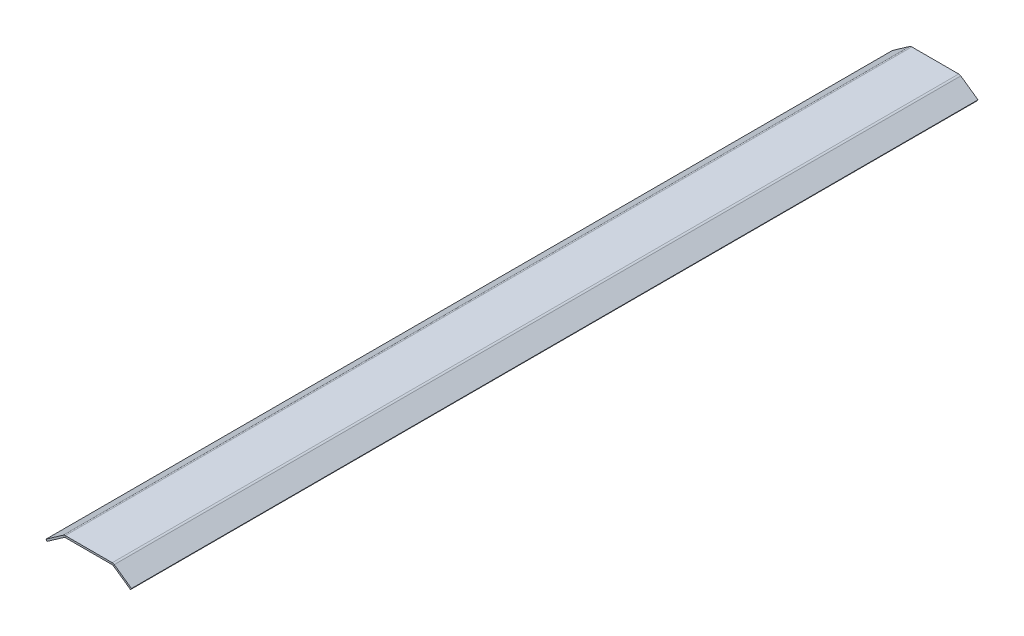
ISO-10303-21;
HEADER;
FILE_DESCRIPTION(('STEP AP214'),'2;1');
FILE_NAME('part.step','',(''),(''),'','','');
FILE_SCHEMA(('AUTOMOTIVE_DESIGN { 1 0 10303 214 1 1 1 1 }'));
ENDSEC;
DATA;
#1=APPLICATION_CONTEXT('core data for automotive mechanical design processes');
#2=APPLICATION_PROTOCOL_DEFINITION('international standard','automotive_design',2000,#1);
#3=PRODUCT_CONTEXT('',#1,'mechanical');
#4=PRODUCT('Part','Part','',(#3));
#5=PRODUCT_RELATED_PRODUCT_CATEGORY('part','',(#4));
#6=PRODUCT_DEFINITION_FORMATION('','',#4);
#7=PRODUCT_DEFINITION_CONTEXT('part definition',#1,'design');
#8=PRODUCT_DEFINITION('design','',#6,#7);
#9=PRODUCT_DEFINITION_SHAPE('','',#8);
#10=(LENGTH_UNIT() NAMED_UNIT(*) SI_UNIT(.MILLI.,.METRE.));
#11=(NAMED_UNIT(*) PLANE_ANGLE_UNIT() SI_UNIT($,.RADIAN.));
#12=(NAMED_UNIT(*) SI_UNIT($,.STERADIAN.) SOLID_ANGLE_UNIT());
#13=UNCERTAINTY_MEASURE_WITH_UNIT(LENGTH_MEASURE(1.E-05),#10,'distance_accuracy_value','');
#14=(GEOMETRIC_REPRESENTATION_CONTEXT(3) GLOBAL_UNCERTAINTY_ASSIGNED_CONTEXT((#13)) GLOBAL_UNIT_ASSIGNED_CONTEXT((#10,
#11,#12)) REPRESENTATION_CONTEXT('',''));
#15=CARTESIAN_POINT('',(0.,0.,0.));
#16=DIRECTION('',(0.,0.,1.));
#17=DIRECTION('',(1.,0.,0.));
#18=AXIS2_PLACEMENT_3D('',#15,#16,#17);
#19=CARTESIAN_POINT('',(13.8332776474721,-0.180847955711021,-478.));
#20=DIRECTION('',(0.,0.,-1.));
#21=DIRECTION('',(-1.,0.,0.));
#22=AXIS2_PLACEMENT_3D('',#19,#20,#21);
#23=PLANE('',#22);
#24=DIRECTION('',(0.573576436351041,0.819152044288995,0.));
#25=VECTOR('',#24,1.);
#26=CARTESIAN_POINT('',(13.8332776474721,-0.180847955711021,-478.));
#27=LINE('',#26,#25);
#28=CARTESIAN_POINT('',(13.8332776474721,-0.180847955711021,-478.));
#29=VERTEX_POINT('',#28);
#30=CARTESIAN_POINT('',(14.4068540838231,0.638304088577982,-478.));
#31=VERTEX_POINT('',#30);
#32=EDGE_CURVE('E11',#29,#31,#27,.T.);
#33=ORIENTED_EDGE('',*,*,#32,.F.);
#34=CARTESIAN_POINT('',(13.259701211121,-1.00000000000001,-478.));
#35=DIRECTION('',(0.,0.,-1.));
#36=DIRECTION('',(-1.,0.,0.));
#37=AXIS2_PLACEMENT_3D('',#34,#35,#36);
#38=CIRCLE('',#37,1.);
#39=CARTESIAN_POINT('',(13.259701211121,0.,-478.));
#40=VERTEX_POINT('',#39);
#41=EDGE_CURVE('E140',#29,#40,#38,.F.);
#42=ORIENTED_EDGE('',*,*,#41,.T.);
#43=DIRECTION('',(0.,-1.,0.));
#44=VECTOR('',#43,1.);
#45=CARTESIAN_POINT('',(13.259701211121,1.,-478.));
#46=LINE('',#45,#44);
#47=CARTESIAN_POINT('',(13.259701211121,1.,-478.));
#48=VERTEX_POINT('',#47);
#49=EDGE_CURVE('E44',#48,#40,#46,.T.);
#50=ORIENTED_EDGE('',*,*,#49,.F.);
#51=CARTESIAN_POINT('',(13.259701211121,-1.00000000000001,-478.));
#52=DIRECTION('',(0.,0.,1.));
#53=DIRECTION('',(1.,0.,0.));
#54=AXIS2_PLACEMENT_3D('',#51,#52,#53);
#55=CIRCLE('',#54,2.);
#56=EDGE_CURVE('E137',#31,#48,#55,.T.);
#57=ORIENTED_EDGE('',*,*,#56,.F.);
#58=EDGE_LOOP('',(#33,#42,#50,#57));
#59=FACE_BOUND('',#58,.T.);
#60=ADVANCED_FACE('F36',(#59),#23,.T.);
#61=CARTESIAN_POINT('',(13.259701211121,1.,-478.));
#62=DIRECTION('',(0.,0.,-1.));
#63=DIRECTION('',(-1.,0.,0.));
#64=AXIS2_PLACEMENT_3D('',#61,#62,#63);
#65=PLANE('',#64);
#66=DIRECTION('',(-0.819152044288995,0.573576436351042,0.));
#67=VECTOR('',#66,1.);
#68=CARTESIAN_POINT('',(13.575,0.,-478.));
#69=LINE('',#68,#67);
#70=CARTESIAN_POINT('',(23.5720360471949,-7.,-478.));
#71=VERTEX_POINT('',#70);
#72=EDGE_CURVE('E257',#71,#29,#69,.T.);
#73=ORIENTED_EDGE('',*,*,#72,.T.);
#74=ORIENTED_EDGE('',*,*,#32,.T.);
#75=DIRECTION('',(-0.819152044288995,0.573576436351042,0.));
#76=VECTOR('',#75,1.);
#77=CARTESIAN_POINT('',(14.148576436351,0.819152044288995,-478.));
#78=LINE('',#77,#76);
#79=CARTESIAN_POINT('',(24.145612483546,-6.18084795571101,-478.));
#80=VERTEX_POINT('',#79);
#81=EDGE_CURVE('E169',#80,#31,#78,.T.);
#82=ORIENTED_EDGE('',*,*,#81,.F.);
#83=DIRECTION('',(-0.573576436351044,-0.819152044288993,0.));
#84=VECTOR('',#83,1.);
#85=CARTESIAN_POINT('',(24.145612483546,-6.18084795571101,-478.));
#86=LINE('',#85,#84);
#87=EDGE_CURVE('E171',#80,#71,#86,.T.);
#88=ORIENTED_EDGE('',*,*,#87,.T.);
#89=EDGE_LOOP('',(#73,#74,#82,#88));
#90=FACE_BOUND('',#89,.T.);
#91=ADVANCED_FACE('F268',(#90),#65,.T.);
#92=CARTESIAN_POINT('',(13.259701211121,0.,0.));
#93=DIRECTION('',(0.,0.,1.));
#94=DIRECTION('',(1.,0.,0.));
#95=AXIS2_PLACEMENT_3D('',#92,#93,#94);
#96=PLANE('',#95);
#97=DIRECTION('',(0.,1.,0.));
#98=VECTOR('',#97,1.);
#99=CARTESIAN_POINT('',(13.259701211121,0.,0.));
#100=LINE('',#99,#98);
#101=CARTESIAN_POINT('',(13.259701211121,0.,0.));
#102=VERTEX_POINT('',#101);
#103=CARTESIAN_POINT('',(13.259701211121,1.,0.));
#104=VERTEX_POINT('',#103);
#105=EDGE_CURVE('E145',#102,#104,#100,.T.);
#106=ORIENTED_EDGE('',*,*,#105,.F.);
#107=CARTESIAN_POINT('',(13.259701211121,-1.00000000000001,0.));
#108=DIRECTION('',(0.,0.,-1.));
#109=DIRECTION('',(-1.,0.,0.));
#110=AXIS2_PLACEMENT_3D('',#107,#108,#109);
#111=CIRCLE('',#110,1.);
#112=CARTESIAN_POINT('',(13.8332776474721,-0.180847955711021,0.));
#113=VERTEX_POINT('',#112);
#114=EDGE_CURVE('E191',#113,#102,#111,.F.);
#115=ORIENTED_EDGE('',*,*,#114,.F.);
#116=DIRECTION('',(-0.573576436351041,-0.819152044288995,0.));
#117=VECTOR('',#116,1.);
#118=CARTESIAN_POINT('',(14.4068540838231,0.638304088577982,0.));
#119=LINE('',#118,#117);
#120=CARTESIAN_POINT('',(14.4068540838231,0.638304088577982,0.));
#121=VERTEX_POINT('',#120);
#122=EDGE_CURVE('E237',#121,#113,#119,.T.);
#123=ORIENTED_EDGE('',*,*,#122,.F.);
#124=CARTESIAN_POINT('',(13.259701211121,-1.00000000000001,0.));
#125=DIRECTION('',(0.,0.,1.));
#126=DIRECTION('',(1.,0.,0.));
#127=AXIS2_PLACEMENT_3D('',#124,#125,#126);
#128=CIRCLE('',#127,2.);
#129=EDGE_CURVE('E202',#121,#104,#128,.T.);
#130=ORIENTED_EDGE('',*,*,#129,.T.);
#131=EDGE_LOOP('',(#106,#115,#123,#130));
#132=FACE_BOUND('',#131,.T.);
#133=ADVANCED_FACE('F245',(#132),#96,.T.);
#134=CARTESIAN_POINT('',(14.4068540838231,0.638304088577982,0.));
#135=DIRECTION('',(0.,0.,1.));
#136=DIRECTION('',(1.,0.,0.));
#137=AXIS2_PLACEMENT_3D('',#134,#135,#136);
#138=PLANE('',#137);
#139=DIRECTION('',(-1.,0.,0.));
#140=VECTOR('',#139,1.);
#141=CARTESIAN_POINT('',(-13.575,0.,0.));
#142=LINE('',#141,#140);
#143=CARTESIAN_POINT('',(-13.259701211121,0.,0.));
#144=VERTEX_POINT('',#143);
#145=EDGE_CURVE('E188',#102,#144,#142,.T.);
#146=ORIENTED_EDGE('',*,*,#145,.F.);
#147=ORIENTED_EDGE('',*,*,#105,.T.);
#148=DIRECTION('',(1.,0.,0.));
#149=VECTOR('',#148,1.);
#150=CARTESIAN_POINT('',(-13.575,1.,0.));
#151=LINE('',#150,#149);
#152=CARTESIAN_POINT('',(-13.259701211121,1.,0.));
#153=VERTEX_POINT('',#152);
#154=EDGE_CURVE('E154',#104,#153,#151,.F.);
#155=ORIENTED_EDGE('',*,*,#154,.T.);
#156=DIRECTION('',(0.,-1.,0.));
#157=VECTOR('',#156,1.);
#158=CARTESIAN_POINT('',(-13.259701211121,1.,0.));
#159=LINE('',#158,#157);
#160=EDGE_CURVE('E93',#153,#144,#159,.T.);
#161=ORIENTED_EDGE('',*,*,#160,.T.);
#162=EDGE_LOOP('',(#146,#147,#155,#161));
#163=FACE_BOUND('',#162,.T.);
#164=ADVANCED_FACE('F241',(#163),#138,.T.);
#165=CARTESIAN_POINT('',(-13.259701211121,0.,-478.));
#166=DIRECTION('',(0.,0.,-1.));
#167=DIRECTION('',(-1.,0.,0.));
#168=AXIS2_PLACEMENT_3D('',#165,#166,#167);
#169=PLANE('',#168);
#170=DIRECTION('',(0.,1.,0.));
#171=VECTOR('',#170,1.);
#172=CARTESIAN_POINT('',(-13.259701211121,0.,-478.));
#173=LINE('',#172,#171);
#174=CARTESIAN_POINT('',(-13.259701211121,0.,-478.));
#175=VERTEX_POINT('',#174);
#176=CARTESIAN_POINT('',(-13.259701211121,1.,-478.));
#177=VERTEX_POINT('',#176);
#178=EDGE_CURVE('E162',#175,#177,#173,.T.);
#179=ORIENTED_EDGE('',*,*,#178,.F.);
#180=CARTESIAN_POINT('',(-13.259701211121,-1.,-478.));
#181=DIRECTION('',(0.,0.,-1.));
#182=DIRECTION('',(-1.,0.,0.));
#183=AXIS2_PLACEMENT_3D('',#180,#181,#182);
#184=CIRCLE('',#183,1.);
#185=CARTESIAN_POINT('',(-13.8332776474721,-0.180847955711005,-478.));
#186=VERTEX_POINT('',#185);
#187=EDGE_CURVE('E255',#175,#186,#184,.F.);
#188=ORIENTED_EDGE('',*,*,#187,.T.);
#189=DIRECTION('',(0.573576436351041,-0.819152044288995,0.));
#190=VECTOR('',#189,1.);
#191=CARTESIAN_POINT('',(-14.4068540838231,0.638304088577989,-478.));
#192=LINE('',#191,#190);
#193=CARTESIAN_POINT('',(-14.4068540838231,0.638304088577989,-478.));
#194=VERTEX_POINT('',#193);
#195=EDGE_CURVE('E52',#194,#186,#192,.T.);
#196=ORIENTED_EDGE('',*,*,#195,.F.);
#197=CARTESIAN_POINT('',(-13.259701211121,-1.,-478.));
#198=DIRECTION('',(0.,0.,1.));
#199=DIRECTION('',(1.,0.,0.));
#200=AXIS2_PLACEMENT_3D('',#197,#198,#199);
#201=CIRCLE('',#200,2.);
#202=EDGE_CURVE('E164',#177,#194,#201,.T.);
#203=ORIENTED_EDGE('',*,*,#202,.F.);
#204=EDGE_LOOP('',(#179,#188,#196,#203));
#205=FACE_BOUND('',#204,.T.);
#206=ADVANCED_FACE('F300',(#205),#169,.T.);
#207=CARTESIAN_POINT('',(-14.4068540838231,0.638304088577989,-478.));
#208=DIRECTION('',(0.,0.,-1.));
#209=DIRECTION('',(-1.,0.,0.));
#210=AXIS2_PLACEMENT_3D('',#207,#208,#209);
#211=PLANE('',#210);
#212=DIRECTION('',(-1.,0.,0.));
#213=VECTOR('',#212,1.);
#214=CARTESIAN_POINT('',(-13.575,0.,-478.));
#215=LINE('',#214,#213);
#216=EDGE_CURVE('E253',#40,#175,#215,.T.);
#217=ORIENTED_EDGE('',*,*,#216,.T.);
#218=ORIENTED_EDGE('',*,*,#178,.T.);
#219=DIRECTION('',(1.,0.,0.));
#220=VECTOR('',#219,1.);
#221=CARTESIAN_POINT('',(-13.575,1.,-478.));
#222=LINE('',#221,#220);
#223=EDGE_CURVE('E152',#48,#177,#222,.F.);
#224=ORIENTED_EDGE('',*,*,#223,.F.);
#225=ORIENTED_EDGE('',*,*,#49,.T.);
#226=EDGE_LOOP('',(#217,#218,#224,#225));
#227=FACE_BOUND('',#226,.T.);
#228=ADVANCED_FACE('F161',(#227),#211,.T.);
#229=CARTESIAN_POINT('',(-13.8332776474721,-0.180847955711005,0.));
#230=DIRECTION('',(0.,0.,1.));
#231=DIRECTION('',(1.,0.,0.));
#232=AXIS2_PLACEMENT_3D('',#229,#230,#231);
#233=PLANE('',#232);
#234=DIRECTION('',(-0.573576436351041,0.819152044288995,0.));
#235=VECTOR('',#234,1.);
#236=CARTESIAN_POINT('',(-13.8332776474721,-0.180847955711005,0.));
#237=LINE('',#236,#235);
#238=CARTESIAN_POINT('',(-13.8332776474721,-0.180847955711005,0.));
#239=VERTEX_POINT('',#238);
#240=CARTESIAN_POINT('',(-14.4068540838231,0.638304088577989,0.));
#241=VERTEX_POINT('',#240);
#242=EDGE_CURVE('E100',#239,#241,#237,.T.);
#243=ORIENTED_EDGE('',*,*,#242,.F.);
#244=CARTESIAN_POINT('',(-13.259701211121,-1.,0.));
#245=DIRECTION('',(0.,0.,-1.));
#246=DIRECTION('',(-1.,0.,0.));
#247=AXIS2_PLACEMENT_3D('',#244,#245,#246);
#248=CIRCLE('',#247,1.);
#249=EDGE_CURVE('E185',#144,#239,#248,.F.);
#250=ORIENTED_EDGE('',*,*,#249,.F.);
#251=ORIENTED_EDGE('',*,*,#160,.F.);
#252=CARTESIAN_POINT('',(-13.259701211121,-1.,0.));
#253=DIRECTION('',(0.,0.,1.));
#254=DIRECTION('',(1.,0.,0.));
#255=AXIS2_PLACEMENT_3D('',#252,#253,#254);
#256=CIRCLE('',#255,2.);
#257=EDGE_CURVE('E205',#153,#241,#256,.T.);
#258=ORIENTED_EDGE('',*,*,#257,.T.);
#259=EDGE_LOOP('',(#243,#250,#251,#258));
#260=FACE_BOUND('',#259,.T.);
#261=ADVANCED_FACE('F305',(#260),#233,.T.);
#262=CARTESIAN_POINT('',(-13.259701211121,1.,0.));
#263=DIRECTION('',(0.,0.,1.));
#264=DIRECTION('',(1.,0.,0.));
#265=AXIS2_PLACEMENT_3D('',#262,#263,#264);
#266=PLANE('',#265);
#267=DIRECTION('',(-0.819152044288995,-0.573576436351042,0.));
#268=VECTOR('',#267,1.);
#269=CARTESIAN_POINT('',(-13.575,0.,0.));
#270=LINE('',#269,#268);
#271=CARTESIAN_POINT('',(-23.5720360471949,-7.,0.));
#272=VERTEX_POINT('',#271);
#273=EDGE_CURVE('E183',#239,#272,#270,.T.);
#274=ORIENTED_EDGE('',*,*,#273,.F.);
#275=ORIENTED_EDGE('',*,*,#242,.T.);
#276=DIRECTION('',(-0.819152044288995,-0.573576436351042,0.));
#277=VECTOR('',#276,1.);
#278=CARTESIAN_POINT('',(-14.148576436351,0.819152044288995,0.));
#279=LINE('',#278,#277);
#280=CARTESIAN_POINT('',(-24.145612483546,-6.18084795571101,0.));
#281=VERTEX_POINT('',#280);
#282=EDGE_CURVE('E178',#241,#281,#279,.T.);
#283=ORIENTED_EDGE('',*,*,#282,.T.);
#284=DIRECTION('',(-0.573576436351044,0.819152044288993,0.));
#285=VECTOR('',#284,1.);
#286=CARTESIAN_POINT('',(-23.5720360471949,-7.,0.));
#287=LINE('',#286,#285);
#288=EDGE_CURVE('E180',#272,#281,#287,.T.);
#289=ORIENTED_EDGE('',*,*,#288,.F.);
#290=EDGE_LOOP('',(#274,#275,#283,#289));
#291=FACE_BOUND('',#290,.T.);
#292=ADVANCED_FACE('F308',(#291),#266,.T.);
#293=CARTESIAN_POINT('',(-14.148576436351,0.819152044288995,-478.));
#294=DIRECTION('',(-0.573576436351042,0.819152044288995,0.));
#295=DIRECTION('',(-0.819152044288995,-0.573576436351042,0.));
#296=AXIS2_PLACEMENT_3D('',#293,#294,#295);
#297=PLANE('',#296);
#298=ORIENTED_EDGE('',*,*,#282,.F.);
#299=DIRECTION('',(0.,0.,1.));
#300=VECTOR('',#299,1.);
#301=CARTESIAN_POINT('',(-14.4068540838231,0.638304088577989,-478.));
#302=LINE('',#301,#300);
#303=EDGE_CURVE('E208',#194,#241,#302,.T.);
#304=ORIENTED_EDGE('',*,*,#303,.F.);
#305=DIRECTION('',(-0.819152044288995,-0.573576436351042,0.));
#306=VECTOR('',#305,1.);
#307=CARTESIAN_POINT('',(-14.148576436351,0.819152044288995,-478.));
#308=LINE('',#307,#306);
#309=CARTESIAN_POINT('',(-24.145612483546,-6.18084795571101,-478.));
#310=VERTEX_POINT('',#309);
#311=EDGE_CURVE('E207',#194,#310,#308,.T.);
#312=ORIENTED_EDGE('',*,*,#311,.T.);
#313=DIRECTION('',(0.,0.,1.));
#314=VECTOR('',#313,1.);
#315=CARTESIAN_POINT('',(-24.145612483546,-6.18084795571101,-478.));
#316=LINE('',#315,#314);
#317=EDGE_CURVE('E177',#310,#281,#316,.T.);
#318=ORIENTED_EDGE('',*,*,#317,.T.);
#319=EDGE_LOOP('',(#298,#304,#312,#318));
#320=FACE_BOUND('',#319,.T.);
#321=ADVANCED_FACE('F311',(#320),#297,.T.);
#322=CARTESIAN_POINT('',(-13.259701211121,-1.,-478.));
#323=DIRECTION('',(0.,0.,1.));
#324=DIRECTION('',(1.,0.,0.));
#325=AXIS2_PLACEMENT_3D('',#322,#323,#324);
#326=CYLINDRICAL_SURFACE('',#325,2.);
#327=ORIENTED_EDGE('',*,*,#257,.F.);
#328=DIRECTION('',(0.,0.,1.));
#329=VECTOR('',#328,1.);
#330=CARTESIAN_POINT('',(-13.259701211121,1.,-478.));
#331=LINE('',#330,#329);
#332=EDGE_CURVE('E158',#177,#153,#331,.T.);
#333=ORIENTED_EDGE('',*,*,#332,.F.);
#334=ORIENTED_EDGE('',*,*,#202,.T.);
#335=ORIENTED_EDGE('',*,*,#303,.T.);
#336=EDGE_LOOP('',(#327,#333,#334,#335));
#337=FACE_BOUND('',#336,.T.);
#338=ADVANCED_FACE('F314',(#337),#326,.T.);
#339=CARTESIAN_POINT('',(-13.575,1.,-478.));
#340=DIRECTION('',(0.,1.,0.));
#341=DIRECTION('',(0.,0.,1.));
#342=AXIS2_PLACEMENT_3D('',#339,#340,#341);
#343=PLANE('',#342);
#344=ORIENTED_EDGE('',*,*,#154,.F.);
#345=DIRECTION('',(0.,0.,1.));
#346=VECTOR('',#345,1.);
#347=CARTESIAN_POINT('',(13.259701211121,1.,-478.));
#348=LINE('',#347,#346);
#349=EDGE_CURVE('E150',#48,#104,#348,.T.);
#350=ORIENTED_EDGE('',*,*,#349,.F.);
#351=ORIENTED_EDGE('',*,*,#223,.T.);
#352=ORIENTED_EDGE('',*,*,#332,.T.);
#353=EDGE_LOOP('',(#344,#350,#351,#352));
#354=FACE_BOUND('',#353,.T.);
#355=ADVANCED_FACE('F151',(#354),#343,.T.);
#356=CARTESIAN_POINT('',(13.259701211121,-1.00000000000001,-478.));
#357=DIRECTION('',(0.,0.,1.));
#358=DIRECTION('',(1.,0.,0.));
#359=AXIS2_PLACEMENT_3D('',#356,#357,#358);
#360=CYLINDRICAL_SURFACE('',#359,2.);
#361=ORIENTED_EDGE('',*,*,#129,.F.);
#362=DIRECTION('',(0.,0.,1.));
#363=VECTOR('',#362,1.);
#364=CARTESIAN_POINT('',(14.4068540838231,0.638304088577982,-478.));
#365=LINE('',#364,#363);
#366=EDGE_CURVE('E159',#31,#121,#365,.T.);
#367=ORIENTED_EDGE('',*,*,#366,.F.);
#368=ORIENTED_EDGE('',*,*,#56,.T.);
#369=ORIENTED_EDGE('',*,*,#349,.T.);
#370=EDGE_LOOP('',(#361,#367,#368,#369));
#371=FACE_BOUND('',#370,.T.);
#372=ADVANCED_FACE('F167',(#371),#360,.T.);
#373=CARTESIAN_POINT('',(14.148576436351,0.819152044288995,-478.));
#374=DIRECTION('',(0.573576436351042,0.819152044288995,0.));
#375=DIRECTION('',(-0.819152044288995,0.573576436351042,0.));
#376=AXIS2_PLACEMENT_3D('',#373,#374,#375);
#377=PLANE('',#376);
#378=DIRECTION('',(-0.819152044288995,0.573576436351042,0.));
#379=VECTOR('',#378,1.);
#380=CARTESIAN_POINT('',(14.148576436351,0.819152044288995,0.));
#381=LINE('',#380,#379);
#382=CARTESIAN_POINT('',(24.145612483546,-6.18084795571101,0.));
#383=VERTEX_POINT('',#382);
#384=EDGE_CURVE('E199',#383,#121,#381,.T.);
#385=ORIENTED_EDGE('',*,*,#384,.F.);
#386=DIRECTION('',(0.,0.,1.));
#387=VECTOR('',#386,1.);
#388=CARTESIAN_POINT('',(24.145612483546,-6.18084795571101,-478.));
#389=LINE('',#388,#387);
#390=EDGE_CURVE('E212',#80,#383,#389,.T.);
#391=ORIENTED_EDGE('',*,*,#390,.F.);
#392=ORIENTED_EDGE('',*,*,#81,.T.);
#393=ORIENTED_EDGE('',*,*,#366,.T.);
#394=EDGE_LOOP('',(#385,#391,#392,#393));
#395=FACE_BOUND('',#394,.T.);
#396=ADVANCED_FACE('F280',(#395),#377,.T.);
#397=CARTESIAN_POINT('',(24.145612483546,-6.18084795571101,-478.));
#398=DIRECTION('',(-0.819152044288993,0.573576436351044,0.));
#399=DIRECTION('',(-0.573576436351044,-0.819152044288993,0.));
#400=AXIS2_PLACEMENT_3D('',#397,#398,#399);
#401=PLANE('',#400);
#402=DIRECTION('',(-0.573576436351044,-0.819152044288993,0.));
#403=VECTOR('',#402,1.);
#404=CARTESIAN_POINT('',(24.145612483546,-6.18084795571101,0.));
#405=LINE('',#404,#403);
#406=CARTESIAN_POINT('',(23.5720360471949,-7.,0.));
#407=VERTEX_POINT('',#406);
#408=EDGE_CURVE('E197',#383,#407,#405,.T.);
#409=ORIENTED_EDGE('',*,*,#408,.T.);
#410=DIRECTION('',(0.,0.,1.));
#411=VECTOR('',#410,1.);
#412=CARTESIAN_POINT('',(23.5720360471949,-7.,-478.));
#413=LINE('',#412,#411);
#414=EDGE_CURVE('E214',#71,#407,#413,.T.);
#415=ORIENTED_EDGE('',*,*,#414,.F.);
#416=ORIENTED_EDGE('',*,*,#87,.F.);
#417=ORIENTED_EDGE('',*,*,#390,.T.);
#418=EDGE_LOOP('',(#409,#415,#416,#417));
#419=FACE_BOUND('',#418,.T.);
#420=ADVANCED_FACE('F271',(#419),#401,.F.);
#421=CARTESIAN_POINT('',(13.575,0.,-478.));
#422=DIRECTION('',(0.573576436351042,0.819152044288995,0.));
#423=DIRECTION('',(-0.819152044288995,0.573576436351042,0.));
#424=AXIS2_PLACEMENT_3D('',#421,#422,#423);
#425=PLANE('',#424);
#426=DIRECTION('',(-0.819152044288995,0.573576436351042,0.));
#427=VECTOR('',#426,1.);
#428=CARTESIAN_POINT('',(13.575,0.,0.));
#429=LINE('',#428,#427);
#430=EDGE_CURVE('E194',#407,#113,#429,.T.);
#431=ORIENTED_EDGE('',*,*,#430,.T.);
#432=DIRECTION('',(0.,0.,1.));
#433=VECTOR('',#432,1.);
#434=CARTESIAN_POINT('',(13.8332776474721,-0.180847955711021,-478.));
#435=LINE('',#434,#433);
#436=EDGE_CURVE('E217',#29,#113,#435,.T.);
#437=ORIENTED_EDGE('',*,*,#436,.F.);
#438=ORIENTED_EDGE('',*,*,#72,.F.);
#439=ORIENTED_EDGE('',*,*,#414,.T.);
#440=EDGE_LOOP('',(#431,#437,#438,#439));
#441=FACE_BOUND('',#440,.T.);
#442=ADVANCED_FACE('F275',(#441),#425,.F.);
#443=CARTESIAN_POINT('',(13.259701211121,-1.00000000000001,-478.));
#444=DIRECTION('',(0.,0.,1.));
#445=DIRECTION('',(1.,0.,0.));
#446=AXIS2_PLACEMENT_3D('',#443,#444,#445);
#447=CYLINDRICAL_SURFACE('',#446,1.);
#448=ORIENTED_EDGE('',*,*,#114,.T.);
#449=DIRECTION('',(0.,0.,1.));
#450=VECTOR('',#449,1.);
#451=CARTESIAN_POINT('',(13.259701211121,0.,-478.));
#452=LINE('',#451,#450);
#453=EDGE_CURVE('E220',#40,#102,#452,.T.);
#454=ORIENTED_EDGE('',*,*,#453,.F.);
#455=ORIENTED_EDGE('',*,*,#41,.F.);
#456=ORIENTED_EDGE('',*,*,#436,.T.);
#457=EDGE_LOOP('',(#448,#454,#455,#456));
#458=FACE_BOUND('',#457,.T.);
#459=ADVANCED_FACE('F247',(#458),#447,.F.);
#460=CARTESIAN_POINT('',(-13.575,0.,-478.));
#461=DIRECTION('',(0.,1.,0.));
#462=DIRECTION('',(0.,0.,1.));
#463=AXIS2_PLACEMENT_3D('',#460,#461,#462);
#464=PLANE('',#463);
#465=ORIENTED_EDGE('',*,*,#145,.T.);
#466=DIRECTION('',(0.,0.,1.));
#467=VECTOR('',#466,1.);
#468=CARTESIAN_POINT('',(-13.259701211121,0.,-478.));
#469=LINE('',#468,#467);
#470=EDGE_CURVE('E223',#175,#144,#469,.T.);
#471=ORIENTED_EDGE('',*,*,#470,.F.);
#472=ORIENTED_EDGE('',*,*,#216,.F.);
#473=ORIENTED_EDGE('',*,*,#453,.T.);
#474=EDGE_LOOP('',(#465,#471,#472,#473));
#475=FACE_BOUND('',#474,.T.);
#476=ADVANCED_FACE('F251',(#475),#464,.F.);
#477=CARTESIAN_POINT('',(-13.259701211121,-1.,-478.));
#478=DIRECTION('',(0.,0.,1.));
#479=DIRECTION('',(1.,0.,0.));
#480=AXIS2_PLACEMENT_3D('',#477,#478,#479);
#481=CYLINDRICAL_SURFACE('',#480,1.);
#482=ORIENTED_EDGE('',*,*,#249,.T.);
#483=DIRECTION('',(0.,0.,1.));
#484=VECTOR('',#483,1.);
#485=CARTESIAN_POINT('',(-13.8332776474721,-0.180847955711005,-478.));
#486=LINE('',#485,#484);
#487=EDGE_CURVE('E226',#186,#239,#486,.T.);
#488=ORIENTED_EDGE('',*,*,#487,.F.);
#489=ORIENTED_EDGE('',*,*,#187,.F.);
#490=ORIENTED_EDGE('',*,*,#470,.T.);
#491=EDGE_LOOP('',(#482,#488,#489,#490));
#492=FACE_BOUND('',#491,.T.);
#493=ADVANCED_FACE('F324',(#492),#481,.F.);
#494=CARTESIAN_POINT('',(-13.575,0.,-478.));
#495=DIRECTION('',(-0.573576436351042,0.819152044288995,0.));
#496=DIRECTION('',(-0.819152044288995,-0.573576436351042,0.));
#497=AXIS2_PLACEMENT_3D('',#494,#495,#496);
#498=PLANE('',#497);
#499=ORIENTED_EDGE('',*,*,#273,.T.);
#500=DIRECTION('',(0.,0.,1.));
#501=VECTOR('',#500,1.);
#502=CARTESIAN_POINT('',(-23.5720360471949,-7.,-478.));
#503=LINE('',#502,#501);
#504=CARTESIAN_POINT('',(-23.5720360471949,-7.,-478.));
#505=VERTEX_POINT('',#504);
#506=EDGE_CURVE('E229',#505,#272,#503,.T.);
#507=ORIENTED_EDGE('',*,*,#506,.F.);
#508=DIRECTION('',(-0.819152044288995,-0.573576436351042,0.));
#509=VECTOR('',#508,1.);
#510=CARTESIAN_POINT('',(-13.575,0.,-478.));
#511=LINE('',#510,#509);
#512=EDGE_CURVE('E259',#186,#505,#511,.T.);
#513=ORIENTED_EDGE('',*,*,#512,.F.);
#514=ORIENTED_EDGE('',*,*,#487,.T.);
#515=EDGE_LOOP('',(#499,#507,#513,#514));
#516=FACE_BOUND('',#515,.T.);
#517=ADVANCED_FACE('F320',(#516),#498,.F.);
#518=CARTESIAN_POINT('',(-23.5720360471949,-7.,-478.));
#519=DIRECTION('',(0.819152044288993,0.573576436351044,0.));
#520=DIRECTION('',(-0.573576436351044,0.819152044288993,0.));
#521=AXIS2_PLACEMENT_3D('',#518,#519,#520);
#522=PLANE('',#521);
#523=ORIENTED_EDGE('',*,*,#288,.T.);
#524=ORIENTED_EDGE('',*,*,#317,.F.);
#525=DIRECTION('',(-0.573576436351044,0.819152044288993,0.));
#526=VECTOR('',#525,1.);
#527=CARTESIAN_POINT('',(-23.5720360471949,-7.,-478.));
#528=LINE('',#527,#526);
#529=EDGE_CURVE('E109',#505,#310,#528,.T.);
#530=ORIENTED_EDGE('',*,*,#529,.F.);
#531=ORIENTED_EDGE('',*,*,#506,.T.);
#532=EDGE_LOOP('',(#523,#524,#530,#531));
#533=FACE_BOUND('',#532,.T.);
#534=ADVANCED_FACE('F316',(#533),#522,.F.);
#535=CARTESIAN_POINT('',(-13.259701211121,-1.,-478.));
#536=DIRECTION('',(0.,0.,-1.));
#537=DIRECTION('',(-1.,0.,0.));
#538=AXIS2_PLACEMENT_3D('',#535,#536,#537);
#539=PLANE('',#538);
#540=ORIENTED_EDGE('',*,*,#311,.F.);
#541=ORIENTED_EDGE('',*,*,#195,.T.);
#542=ORIENTED_EDGE('',*,*,#512,.T.);
#543=ORIENTED_EDGE('',*,*,#529,.T.);
#544=EDGE_LOOP('',(#540,#541,#542,#543));
#545=FACE_BOUND('',#544,.T.);
#546=ADVANCED_FACE('F319',(#545),#539,.T.);
#547=CARTESIAN_POINT('',(-13.259701211121,-1.,0.));
#548=DIRECTION('',(0.,0.,-1.));
#549=DIRECTION('',(-1.,0.,0.));
#550=AXIS2_PLACEMENT_3D('',#547,#548,#549);
#551=PLANE('',#550);
#552=ORIENTED_EDGE('',*,*,#384,.T.);
#553=ORIENTED_EDGE('',*,*,#122,.T.);
#554=ORIENTED_EDGE('',*,*,#430,.F.);
#555=ORIENTED_EDGE('',*,*,#408,.F.);
#556=EDGE_LOOP('',(#552,#553,#554,#555));
#557=FACE_BOUND('',#556,.T.);
#558=ADVANCED_FACE('F277',(#557),#551,.F.);
#559=CLOSED_SHELL('',(#60,#91,#133,#164,#206,#228,#261,#292,#321,#338,#355,#372,#396,#420,#442,
#459,#476,#493,#517,#534,#546,#558));
#560=MANIFOLD_SOLID_BREP('B2',#559);
#561=ADVANCED_BREP_SHAPE_REPRESENTATION('',(#18,#560),#14);
#562=SHAPE_DEFINITION_REPRESENTATION(#9,#561);
ENDSEC;
END-ISO-10303-21;
